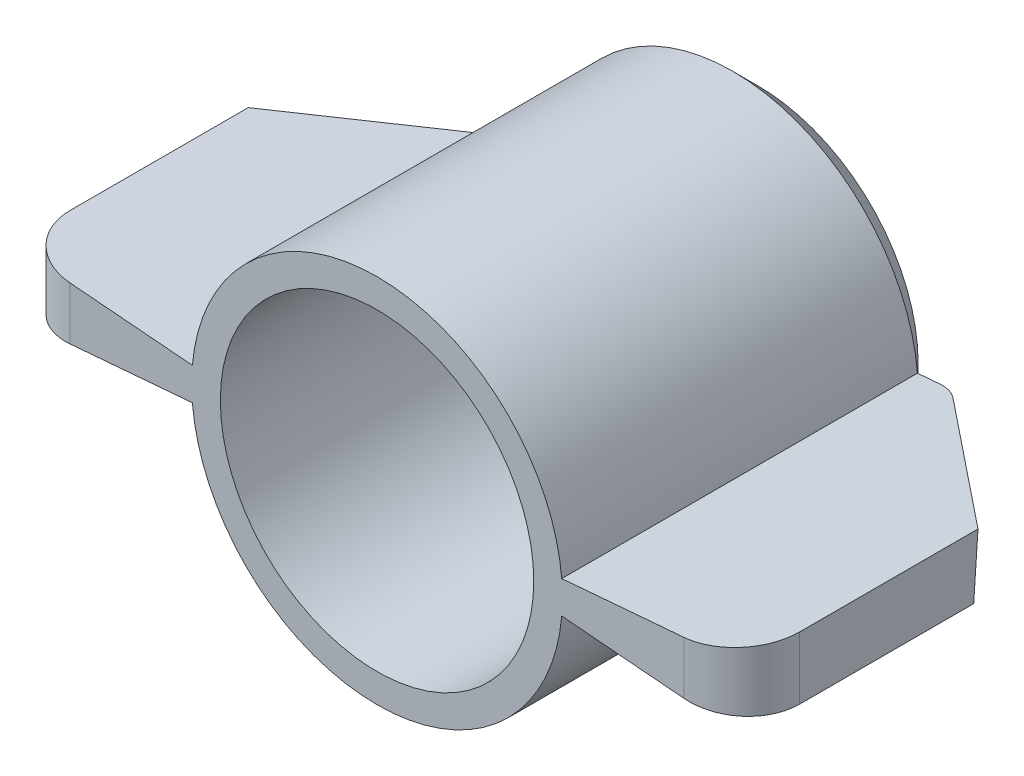
ISO-10303-21;
HEADER;
FILE_DESCRIPTION(('STEP AP214'),'2;1');
FILE_NAME('part.step','',(''),(''),'','','');
FILE_SCHEMA(('AUTOMOTIVE_DESIGN { 1 0 10303 214 1 1 1 1 }'));
ENDSEC;
DATA;
#1=APPLICATION_CONTEXT('core data for automotive mechanical design processes');
#2=APPLICATION_PROTOCOL_DEFINITION('international standard','automotive_design',2000,#1);
#3=PRODUCT_CONTEXT('',#1,'mechanical');
#4=PRODUCT('Part','Part','',(#3));
#5=PRODUCT_RELATED_PRODUCT_CATEGORY('part','',(#4));
#6=PRODUCT_DEFINITION_FORMATION('','',#4);
#7=PRODUCT_DEFINITION_CONTEXT('part definition',#1,'design');
#8=PRODUCT_DEFINITION('design','',#6,#7);
#9=PRODUCT_DEFINITION_SHAPE('','',#8);
#10=(LENGTH_UNIT() NAMED_UNIT(*) SI_UNIT(.MILLI.,.METRE.));
#11=(NAMED_UNIT(*) PLANE_ANGLE_UNIT() SI_UNIT($,.RADIAN.));
#12=(NAMED_UNIT(*) SI_UNIT($,.STERADIAN.) SOLID_ANGLE_UNIT());
#13=UNCERTAINTY_MEASURE_WITH_UNIT(LENGTH_MEASURE(1.E-05),#10,'distance_accuracy_value','');
#14=(GEOMETRIC_REPRESENTATION_CONTEXT(3) GLOBAL_UNCERTAINTY_ASSIGNED_CONTEXT((#13)) GLOBAL_UNIT_ASSIGNED_CONTEXT((#10,
#11,#12)) REPRESENTATION_CONTEXT('',''));
#15=CARTESIAN_POINT('',(0.,0.,0.));
#16=DIRECTION('',(0.,0.,1.));
#17=DIRECTION('',(1.,0.,0.));
#18=AXIS2_PLACEMENT_3D('',#15,#16,#17);
#19=CARTESIAN_POINT('',(5.01,-0.44,0.68));
#20=DIRECTION('',(-0.0832134452583385,-0.996531746874247,0.));
#21=DIRECTION('',(0.996531746874247,-0.0832134452583385,0.));
#22=AXIS2_PLACEMENT_3D('',#19,#20,#21);
#23=PLANE('',#22);
#24=DIRECTION('',(0.,0.,1.));
#25=VECTOR('',#24,1.);
#26=CARTESIAN_POINT('',(9.92,-0.850000000000001,0.68));
#27=LINE('',#26,#25);
#28=CARTESIAN_POINT('',(9.92,-0.849999999999984,4.05));
#29=VERTEX_POINT('',#28);
#30=CARTESIAN_POINT('',(9.92,-0.850000000000001,8.78));
#31=VERTEX_POINT('',#30);
#32=EDGE_CURVE('E134',#29,#31,#27,.T.);
#33=ORIENTED_EDGE('',*,*,#32,.T.);
#34=CARTESIAN_POINT('',(8.35,-0.718900203665989,8.78));
#35=DIRECTION('',(-0.0832134452583385,-0.996531746874247,0.));
#36=DIRECTION('',(-0.996531746874247,0.0832134452583385,0.));
#37=AXIS2_PLACEMENT_3D('',#34,#35,#36);
#38=ELLIPSE('',#37,1.57546410831819,1.57);
#39=CARTESIAN_POINT('',(8.35,-0.718900203665989,10.35));
#40=VERTEX_POINT('',#39);
#41=EDGE_CURVE('E11',#31,#40,#38,.T.);
#42=ORIENTED_EDGE('',*,*,#41,.T.);
#43=DIRECTION('',(0.996531746874247,-0.0832134452583385,0.));
#44=VECTOR('',#43,1.);
#45=CARTESIAN_POINT('',(5.01,-0.44,10.35));
#46=LINE('',#45,#44);
#47=CARTESIAN_POINT('',(5.02067868978206,-0.44089170322009,10.35));
#48=VERTEX_POINT('',#47);
#49=EDGE_CURVE('E163',#48,#40,#46,.T.);
#50=ORIENTED_EDGE('',*,*,#49,.F.);
#51=DIRECTION('',(0.,0.,-1.));
#52=VECTOR('',#51,1.);
#53=CARTESIAN_POINT('',(5.02067868978206,-0.44089170322009,10.35));
#54=LINE('',#53,#52);
#55=CARTESIAN_POINT('',(5.02067868978206,-0.44089170322009,0.679999999999998));
#56=VERTEX_POINT('',#55);
#57=EDGE_CURVE('E173',#56,#48,#54,.F.);
#58=ORIENTED_EDGE('',*,*,#57,.F.);
#59=DIRECTION('',(0.996531746874247,-0.0832134452583385,0.));
#60=VECTOR('',#59,1.);
#61=CARTESIAN_POINT('',(5.01,-0.44,0.68));
#62=LINE('',#61,#60);
#63=CARTESIAN_POINT('',(5.5565518613589,-0.485638750133839,0.68));
#64=VERTEX_POINT('',#63);
#65=EDGE_CURVE('E164',#56,#64,#62,.T.);
#66=ORIENTED_EDGE('',*,*,#65,.T.);
#67=CARTESIAN_POINT('',(5.5565518613589,-0.48563875013384,1.52));
#68=DIRECTION('',(-0.0832134452583385,-0.996531746874247,0.));
#69=DIRECTION('',(0.996531746874247,-0.0832134452583385,0.));
#70=AXIS2_PLACEMENT_3D('',#67,#68,#69);
#71=CIRCLE('',#70,0.84);
#72=CARTESIAN_POINT('',(6.08991778798713,-0.530176434434771,0.872591950166575));
#73=VERTEX_POINT('',#72);
#74=EDGE_CURVE('E138',#64,#73,#71,.T.);
#75=ORIENTED_EDGE('',*,*,#74,.T.);
#76=DIRECTION('',(0.768050803382088,-0.0641345884697875,0.637169300881595));
#77=VECTOR('',#76,1.);
#78=CARTESIAN_POINT('',(5.3541797794434,-0.468740063049245,0.262229106365719));
#79=LINE('',#78,#77);
#80=EDGE_CURVE('E132',#73,#29,#79,.T.);
#81=ORIENTED_EDGE('',*,*,#80,.T.);
#82=EDGE_LOOP('',(#33,#42,#50,#58,#66,#75,#81));
#83=FACE_BOUND('',#82,.T.);
#84=ADVANCED_FACE('F32',(#83),#23,.T.);
#85=CARTESIAN_POINT('',(5.01,0.44,0.68));
#86=DIRECTION('',(0.0832134452583383,-0.996531746874247,0.));
#87=DIRECTION('',(0.996531746874247,0.0832134452583383,0.));
#88=AXIS2_PLACEMENT_3D('',#85,#86,#87);
#89=PLANE('',#88);
#90=DIRECTION('',(0.996531746874247,0.0832134452583383,0.));
#91=VECTOR('',#90,1.);
#92=CARTESIAN_POINT('',(5.01,0.44,10.35));
#93=LINE('',#92,#91);
#94=CARTESIAN_POINT('',(5.02067868978206,0.44089170322009,10.35));
#95=VERTEX_POINT('',#94);
#96=CARTESIAN_POINT('',(8.35,0.718900203665988,10.35));
#97=VERTEX_POINT('',#96);
#98=EDGE_CURVE('E161',#95,#97,#93,.T.);
#99=ORIENTED_EDGE('',*,*,#98,.T.);
#100=CARTESIAN_POINT('',(8.35,0.718900203665988,8.78));
#101=DIRECTION('',(0.0832134452583383,-0.996531746874247,0.));
#102=DIRECTION('',(0.996531746874247,0.0832134452583383,0.));
#103=AXIS2_PLACEMENT_3D('',#100,#101,#102);
#104=ELLIPSE('',#103,1.57546410831819,1.57);
#105=CARTESIAN_POINT('',(9.92,0.85,8.78));
#106=VERTEX_POINT('',#105);
#107=EDGE_CURVE('E54',#97,#106,#104,.F.);
#108=ORIENTED_EDGE('',*,*,#107,.T.);
#109=DIRECTION('',(0.,0.,1.));
#110=VECTOR('',#109,1.);
#111=CARTESIAN_POINT('',(9.92,0.85,0.68));
#112=LINE('',#111,#110);
#113=CARTESIAN_POINT('',(9.92,0.85,3.93305047592308));
#114=VERTEX_POINT('',#113);
#115=EDGE_CURVE('E151',#114,#106,#112,.T.);
#116=ORIENTED_EDGE('',*,*,#115,.F.);
#117=DIRECTION('',(0.772375493653474,0.0644957133193328,0.631883216873959));
#118=VECTOR('',#117,1.);
#119=CARTESIAN_POINT('',(5.38279222210662,0.471129289422345,0.221144194744403));
#120=LINE('',#119,#118);
#121=CARTESIAN_POINT('',(6.17908221406571,0.537621936408746,0.872591950166574));
#122=VERTEX_POINT('',#121);
#123=EDGE_CURVE('E143',#122,#114,#120,.T.);
#124=ORIENTED_EDGE('',*,*,#123,.F.);
#125=CARTESIAN_POINT('',(5.63822599401507,0.492458789724272,1.52));
#126=DIRECTION('',(0.0832134452583383,-0.996531746874247,0.));
#127=DIRECTION('',(-0.996531746874247,-0.0832134452583383,0.));
#128=AXIS2_PLACEMENT_3D('',#125,#126,#127);
#129=ELLIPSE('',#128,0.85179649122807,0.84);
#130=CARTESIAN_POINT('',(5.63822599401507,0.492458789724273,0.68));
#131=VERTEX_POINT('',#130);
#132=EDGE_CURVE('E217',#122,#131,#129,.F.);
#133=ORIENTED_EDGE('',*,*,#132,.T.);
#134=DIRECTION('',(0.996531746874247,0.0832134452583383,0.));
#135=VECTOR('',#134,1.);
#136=CARTESIAN_POINT('',(5.01,0.44,0.68));
#137=LINE('',#136,#135);
#138=CARTESIAN_POINT('',(5.02067868978206,0.44089170322009,0.68));
#139=VERTEX_POINT('',#138);
#140=EDGE_CURVE('E154',#139,#131,#137,.T.);
#141=ORIENTED_EDGE('',*,*,#140,.F.);
#142=DIRECTION('',(0.,0.,-1.));
#143=VECTOR('',#142,1.);
#144=CARTESIAN_POINT('',(5.02067868978206,0.44089170322009,10.35));
#145=LINE('',#144,#143);
#146=EDGE_CURVE('E167',#139,#95,#145,.F.);
#147=ORIENTED_EDGE('',*,*,#146,.T.);
#148=EDGE_LOOP('',(#99,#108,#116,#124,#133,#141,#147));
#149=FACE_BOUND('',#148,.T.);
#150=ADVANCED_FACE('F251',(#149),#89,.F.);
#151=CARTESIAN_POINT('',(9.92,0.,0.68));
#152=DIRECTION('',(1.,0.,0.));
#153=DIRECTION('',(0.,0.,-1.));
#154=AXIS2_PLACEMENT_3D('',#151,#152,#153);
#155=PLANE('',#154);
#156=ORIENTED_EDGE('',*,*,#115,.T.);
#157=DIRECTION('',(0.,1.,0.));
#158=VECTOR('',#157,1.);
#159=CARTESIAN_POINT('',(9.92,0.,8.78));
#160=LINE('',#159,#158);
#161=EDGE_CURVE('E40',#106,#31,#160,.F.);
#162=ORIENTED_EDGE('',*,*,#161,.T.);
#163=ORIENTED_EDGE('',*,*,#32,.F.);
#164=DIRECTION('',(0.,0.997642069995539,-0.0686316266382872));
#165=VECTOR('',#164,1.);
#166=CARTESIAN_POINT('',(9.92,0.226739464335616,3.9759269600536));
#167=LINE('',#166,#165);
#168=EDGE_CURVE('E146',#29,#114,#167,.T.);
#169=ORIENTED_EDGE('',*,*,#168,.T.);
#170=EDGE_LOOP('',(#156,#162,#163,#169));
#171=FACE_BOUND('',#170,.T.);
#172=ADVANCED_FACE('F150',(#171),#155,.T.);
#173=CARTESIAN_POINT('',(0.,0.,0.68));
#174=DIRECTION('',(0.,0.,1.));
#175=DIRECTION('',(1.,0.,0.));
#176=AXIS2_PLACEMENT_3D('',#173,#174,#175);
#177=PLANE('',#176);
#178=ORIENTED_EDGE('',*,*,#140,.T.);
#179=DIRECTION('',(0.0832134452583386,0.996531746874247,0.));
#180=VECTOR('',#179,1.);
#181=CARTESIAN_POINT('',(5.5565518613589,-0.485638750133837,0.68));
#182=LINE('',#181,#180);
#183=EDGE_CURVE('E219',#131,#64,#182,.F.);
#184=ORIENTED_EDGE('',*,*,#183,.T.);
#185=ORIENTED_EDGE('',*,*,#65,.F.);
#186=CARTESIAN_POINT('',(0.,0.,0.679999999999998));
#187=DIRECTION('',(0.,0.,1.));
#188=DIRECTION('',(1.,0.,0.));
#189=AXIS2_PLACEMENT_3D('',#186,#187,#188);
#190=CIRCLE('',#189,5.04);
#191=EDGE_CURVE('E262',#56,#139,#190,.T.);
#192=ORIENTED_EDGE('',*,*,#191,.T.);
#193=EDGE_LOOP('',(#178,#184,#185,#192));
#194=FACE_BOUND('',#193,.T.);
#195=ADVANCED_FACE('F263',(#194),#177,.F.);
#196=CARTESIAN_POINT('',(0.,0.,10.35));
#197=DIRECTION('',(0.,0.,-1.));
#198=DIRECTION('',(-1.,0.,0.));
#199=AXIS2_PLACEMENT_3D('',#196,#197,#198);
#200=CYLINDRICAL_SURFACE('',#199,5.04);
#201=ORIENTED_EDGE('',*,*,#146,.F.);
#202=CARTESIAN_POINT('',(-5.02067868978206,0.44089170322009,0.679999999999998));
#203=VERTEX_POINT('',#202);
#204=EDGE_CURVE('E207',#139,#203,#190,.T.);
#205=ORIENTED_EDGE('',*,*,#204,.T.);
#206=DIRECTION('',(0.,0.,-1.));
#207=VECTOR('',#206,1.);
#208=CARTESIAN_POINT('',(-5.02067868978206,0.44089170322009,10.35));
#209=LINE('',#208,#207);
#210=CARTESIAN_POINT('',(-5.02067868978206,0.44089170322009,10.35));
#211=VERTEX_POINT('',#210);
#212=EDGE_CURVE('E189',#211,#203,#209,.T.);
#213=ORIENTED_EDGE('',*,*,#212,.F.);
#214=CARTESIAN_POINT('',(0.,0.,10.35));
#215=DIRECTION('',(0.,0.,1.));
#216=DIRECTION('',(1.,0.,0.));
#217=AXIS2_PLACEMENT_3D('',#214,#215,#216);
#218=CIRCLE('',#217,5.04);
#219=EDGE_CURVE('E201',#95,#211,#218,.T.);
#220=ORIENTED_EDGE('',*,*,#219,.F.);
#221=EDGE_LOOP('',(#201,#205,#213,#220));
#222=FACE_BOUND('',#221,.T.);
#223=ADVANCED_FACE('F257',(#222),#200,.T.);
#224=CARTESIAN_POINT('',(-5.02067868978206,-0.44089170322009,0.68));
#225=VERTEX_POINT('',#224);
#226=EDGE_CURVE('E212',#225,#56,#190,.T.);
#227=ORIENTED_EDGE('',*,*,#226,.T.);
#228=ORIENTED_EDGE('',*,*,#57,.T.);
#229=CARTESIAN_POINT('',(-5.02067868978206,-0.44089170322009,10.35));
#230=VERTEX_POINT('',#229);
#231=EDGE_CURVE('E204',#230,#48,#218,.T.);
#232=ORIENTED_EDGE('',*,*,#231,.F.);
#233=DIRECTION('',(0.,0.,-1.));
#234=VECTOR('',#233,1.);
#235=CARTESIAN_POINT('',(-5.02067868978206,-0.44089170322009,10.35));
#236=LINE('',#235,#234);
#237=EDGE_CURVE('E194',#225,#230,#236,.F.);
#238=ORIENTED_EDGE('',*,*,#237,.F.);
#239=EDGE_LOOP('',(#227,#228,#232,#238));
#240=FACE_BOUND('',#239,.T.);
#241=ADVANCED_FACE('F270',(#240),#200,.T.);
#242=CARTESIAN_POINT('',(0.,0.,10.35));
#243=DIRECTION('',(0.,0.,1.));
#244=DIRECTION('',(1.,0.,0.));
#245=AXIS2_PLACEMENT_3D('',#242,#243,#244);
#246=PLANE('',#245);
#247=ORIENTED_EDGE('',*,*,#49,.T.);
#248=DIRECTION('',(0.,1.,0.));
#249=VECTOR('',#248,1.);
#250=CARTESIAN_POINT('',(8.35,0.,10.35));
#251=LINE('',#250,#249);
#252=EDGE_CURVE('E240',#40,#97,#251,.T.);
#253=ORIENTED_EDGE('',*,*,#252,.T.);
#254=ORIENTED_EDGE('',*,*,#98,.F.);
#255=ORIENTED_EDGE('',*,*,#219,.T.);
#256=DIRECTION('',(0.996531746874247,-0.0832134452583381,0.));
#257=VECTOR('',#256,1.);
#258=CARTESIAN_POINT('',(-9.92,0.849999999999999,10.35));
#259=LINE('',#258,#257);
#260=CARTESIAN_POINT('',(-8.35,0.718900203665987,10.35));
#261=VERTEX_POINT('',#260);
#262=EDGE_CURVE('E175',#261,#211,#259,.T.);
#263=ORIENTED_EDGE('',*,*,#262,.F.);
#264=DIRECTION('',(0.,-1.,0.));
#265=VECTOR('',#264,1.);
#266=CARTESIAN_POINT('',(-8.35,0.,10.35));
#267=LINE('',#266,#265);
#268=CARTESIAN_POINT('',(-8.35,-0.718900203665989,10.35));
#269=VERTEX_POINT('',#268);
#270=EDGE_CURVE('E231',#261,#269,#267,.T.);
#271=ORIENTED_EDGE('',*,*,#270,.T.);
#272=DIRECTION('',(-0.996531746874247,-0.0832134452583385,0.));
#273=VECTOR('',#272,1.);
#274=CARTESIAN_POINT('',(-5.01,-0.44,10.35));
#275=LINE('',#274,#273);
#276=EDGE_CURVE('E179',#230,#269,#275,.T.);
#277=ORIENTED_EDGE('',*,*,#276,.F.);
#278=ORIENTED_EDGE('',*,*,#231,.T.);
#279=EDGE_LOOP('',(#247,#253,#254,#255,#263,#271,#277,#278));
#280=FACE_BOUND('',#279,.T.);
#281=CARTESIAN_POINT('',(0.,0.,10.35));
#282=DIRECTION('',(0.,0.,1.));
#283=DIRECTION('',(1.,0.,0.));
#284=AXIS2_PLACEMENT_3D('',#281,#282,#283);
#285=CIRCLE('',#284,4.26);
#286=CARTESIAN_POINT('',(4.26,0.,10.35));
#287=VERTEX_POINT('',#286);
#288=EDGE_CURVE('E197',#287,#287,#285,.T.);
#289=ORIENTED_EDGE('',*,*,#288,.F.);
#290=EDGE_LOOP('',(#289));
#291=FACE_BOUND('',#290,.T.);
#292=ADVANCED_FACE('F246',(#280,#291),#246,.T.);
#293=CARTESIAN_POINT('',(0.,0.,0.));
#294=DIRECTION('',(0.,0.,1.));
#295=DIRECTION('',(1.,0.,0.));
#296=AXIS2_PLACEMENT_3D('',#293,#294,#295);
#297=PLANE('',#296);
#298=CARTESIAN_POINT('',(0.,0.,0.));
#299=DIRECTION('',(0.,0.,1.));
#300=DIRECTION('',(1.,0.,0.));
#301=AXIS2_PLACEMENT_3D('',#298,#299,#300);
#302=CIRCLE('',#301,4.26);
#303=CARTESIAN_POINT('',(4.26,0.,0.));
#304=VERTEX_POINT('',#303);
#305=EDGE_CURVE('E198',#304,#304,#302,.T.);
#306=ORIENTED_EDGE('',*,*,#305,.T.);
#307=EDGE_LOOP('',(#306));
#308=FACE_BOUND('',#307,.T.);
#309=CARTESIAN_POINT('',(0.,0.,0.));
#310=DIRECTION('',(0.,0.,1.));
#311=DIRECTION('',(1.,0.,0.));
#312=AXIS2_PLACEMENT_3D('',#309,#310,#311);
#313=CIRCLE('',#312,4.36);
#314=CARTESIAN_POINT('',(4.36,0.,0.));
#315=VERTEX_POINT('',#314);
#316=EDGE_CURVE('E211',#315,#315,#313,.F.);
#317=ORIENTED_EDGE('',*,*,#316,.T.);
#318=EDGE_LOOP('',(#317));
#319=FACE_BOUND('',#318,.T.);
#320=ADVANCED_FACE('F315',(#308,#319),#297,.F.);
#321=CARTESIAN_POINT('',(0.,0.,0.679999999999998));
#322=DIRECTION('',(0.,0.,1.));
#323=DIRECTION('',(1.,0.,0.));
#324=AXIS2_PLACEMENT_3D('',#321,#322,#323);
#325=CONICAL_SURFACE('',#324,5.04,0.785398163397451);
#326=ORIENTED_EDGE('',*,*,#316,.F.);
#327=EDGE_LOOP('',(#326));
#328=FACE_BOUND('',#327,.T.);
#329=EDGE_CURVE('E208',#203,#225,#190,.T.);
#330=ORIENTED_EDGE('',*,*,#329,.F.);
#331=ORIENTED_EDGE('',*,*,#204,.F.);
#332=ORIENTED_EDGE('',*,*,#191,.F.);
#333=ORIENTED_EDGE('',*,*,#226,.F.);
#334=EDGE_LOOP('',(#330,#331,#332,#333));
#335=FACE_BOUND('',#334,.T.);
#336=ADVANCED_FACE('F311',(#328,#335),#325,.T.);
#337=CARTESIAN_POINT('',(0.,0.,0.));
#338=DIRECTION('',(0.,0.,1.));
#339=DIRECTION('',(1.,0.,0.));
#340=AXIS2_PLACEMENT_3D('',#337,#338,#339);
#341=CYLINDRICAL_SURFACE('',#340,4.26);
#342=ORIENTED_EDGE('',*,*,#305,.F.);
#343=EDGE_LOOP('',(#342));
#344=FACE_BOUND('',#343,.T.);
#345=ORIENTED_EDGE('',*,*,#288,.T.);
#346=EDGE_LOOP('',(#345));
#347=FACE_BOUND('',#346,.T.);
#348=ADVANCED_FACE('F301',(#344,#347),#341,.F.);
#349=CARTESIAN_POINT('',(-5.01,-0.44,0.68));
#350=DIRECTION('',(-0.0832134452583385,0.996531746874247,0.));
#351=DIRECTION('',(-0.996531746874247,-0.0832134452583385,0.));
#352=AXIS2_PLACEMENT_3D('',#349,#350,#351);
#353=PLANE('',#352);
#354=ORIENTED_EDGE('',*,*,#276,.T.);
#355=CARTESIAN_POINT('',(-8.35,-0.718900203665989,8.78));
#356=DIRECTION('',(-0.0832134452583385,0.996531746874247,0.));
#357=DIRECTION('',(-0.996531746874247,-0.0832134452583385,0.));
#358=AXIS2_PLACEMENT_3D('',#355,#356,#357);
#359=ELLIPSE('',#358,1.57546410831819,1.57);
#360=CARTESIAN_POINT('',(-9.92,-0.850000000000001,8.78));
#361=VERTEX_POINT('',#360);
#362=EDGE_CURVE('E234',#269,#361,#359,.F.);
#363=ORIENTED_EDGE('',*,*,#362,.T.);
#364=DIRECTION('',(0.,0.,1.));
#365=VECTOR('',#364,1.);
#366=CARTESIAN_POINT('',(-9.92,-0.850000000000001,0.68));
#367=LINE('',#366,#365);
#368=CARTESIAN_POINT('',(-9.92,-0.850000000000059,4.05));
#369=VERTEX_POINT('',#368);
#370=EDGE_CURVE('E186',#369,#361,#367,.T.);
#371=ORIENTED_EDGE('',*,*,#370,.F.);
#372=DIRECTION('',(0.768050803382088,0.0641345884697876,-0.637169300881595));
#373=VECTOR('',#372,1.);
#374=CARTESIAN_POINT('',(-5.3541797794434,-0.468740063049245,0.26222910636572));
#375=LINE('',#374,#373);
#376=CARTESIAN_POINT('',(-6.08991778798713,-0.53017643443477,0.872591950166574));
#377=VERTEX_POINT('',#376);
#378=EDGE_CURVE('E152',#369,#377,#375,.T.);
#379=ORIENTED_EDGE('',*,*,#378,.T.);
#380=CARTESIAN_POINT('',(-5.5565518613589,-0.485638750133839,1.52));
#381=DIRECTION('',(-0.0832134452583385,0.996531746874247,0.));
#382=DIRECTION('',(-0.996531746874247,-0.0832134452583385,0.));
#383=AXIS2_PLACEMENT_3D('',#380,#381,#382);
#384=CIRCLE('',#383,0.84);
#385=CARTESIAN_POINT('',(-5.5565518613589,-0.485638750133839,0.68));
#386=VERTEX_POINT('',#385);
#387=EDGE_CURVE('E225',#377,#386,#384,.F.);
#388=ORIENTED_EDGE('',*,*,#387,.T.);
#389=DIRECTION('',(-0.996531746874247,-0.0832134452583385,0.));
#390=VECTOR('',#389,1.);
#391=CARTESIAN_POINT('',(-5.01,-0.44,0.68));
#392=LINE('',#391,#390);
#393=EDGE_CURVE('E178',#225,#386,#392,.T.);
#394=ORIENTED_EDGE('',*,*,#393,.F.);
#395=ORIENTED_EDGE('',*,*,#237,.T.);
#396=EDGE_LOOP('',(#354,#363,#371,#379,#388,#394,#395));
#397=FACE_BOUND('',#396,.T.);
#398=ADVANCED_FACE('F297',(#397),#353,.F.);
#399=CARTESIAN_POINT('',(-9.92,0.849999999999999,0.68));
#400=DIRECTION('',(-0.083213445258338,-0.996531746874247,0.));
#401=DIRECTION('',(0.996531746874247,-0.0832134452583381,0.));
#402=AXIS2_PLACEMENT_3D('',#399,#400,#401);
#403=PLANE('',#402);
#404=DIRECTION('',(0.,0.,1.));
#405=VECTOR('',#404,1.);
#406=CARTESIAN_POINT('',(-9.92,0.849999999999999,0.68));
#407=LINE('',#406,#405);
#408=CARTESIAN_POINT('',(-9.92,0.849999999999999,3.93305047592308));
#409=VERTEX_POINT('',#408);
#410=CARTESIAN_POINT('',(-9.92,0.849999999999999,8.78));
#411=VERTEX_POINT('',#410);
#412=EDGE_CURVE('E182',#409,#411,#407,.T.);
#413=ORIENTED_EDGE('',*,*,#412,.T.);
#414=CARTESIAN_POINT('',(-8.35,0.718900203665987,8.78));
#415=DIRECTION('',(-0.083213445258338,-0.996531746874247,0.));
#416=DIRECTION('',(0.996531746874247,-0.0832134452583381,0.));
#417=AXIS2_PLACEMENT_3D('',#414,#415,#416);
#418=ELLIPSE('',#417,1.57546410831819,1.57);
#419=EDGE_CURVE('E238',#411,#261,#418,.F.);
#420=ORIENTED_EDGE('',*,*,#419,.T.);
#421=ORIENTED_EDGE('',*,*,#262,.T.);
#422=ORIENTED_EDGE('',*,*,#212,.T.);
#423=DIRECTION('',(0.996531746874247,-0.0832134452583381,0.));
#424=VECTOR('',#423,1.);
#425=CARTESIAN_POINT('',(-9.92,0.849999999999999,0.68));
#426=LINE('',#425,#424);
#427=CARTESIAN_POINT('',(-5.63822599401507,0.492458789724273,0.68));
#428=VERTEX_POINT('',#427);
#429=EDGE_CURVE('E176',#428,#203,#426,.T.);
#430=ORIENTED_EDGE('',*,*,#429,.F.);
#431=CARTESIAN_POINT('',(-5.63822599401507,0.492458789724272,1.52));
#432=DIRECTION('',(-0.083213445258338,-0.996531746874247,0.));
#433=DIRECTION('',(-0.996531746874247,0.0832134452583381,0.));
#434=AXIS2_PLACEMENT_3D('',#431,#432,#433);
#435=ELLIPSE('',#434,0.85179649122807,0.84);
#436=CARTESIAN_POINT('',(-6.17908221406571,0.537621936408745,0.872591950166574));
#437=VERTEX_POINT('',#436);
#438=EDGE_CURVE('E229',#428,#437,#435,.F.);
#439=ORIENTED_EDGE('',*,*,#438,.T.);
#440=DIRECTION('',(-0.772375493653474,0.0644957133193327,0.631883216873959));
#441=VECTOR('',#440,1.);
#442=CARTESIAN_POINT('',(-8.33234509925074,0.717425965517882,2.63418419363625));
#443=LINE('',#442,#441);
#444=EDGE_CURVE('E157',#437,#409,#443,.T.);
#445=ORIENTED_EDGE('',*,*,#444,.T.);
#446=EDGE_LOOP('',(#413,#420,#421,#422,#430,#439,#445));
#447=FACE_BOUND('',#446,.T.);
#448=ADVANCED_FACE('F300',(#447),#403,.F.);
#449=CARTESIAN_POINT('',(-9.92,0.,0.68));
#450=DIRECTION('',(-1.,0.,0.));
#451=DIRECTION('',(0.,0.,1.));
#452=AXIS2_PLACEMENT_3D('',#449,#450,#451);
#453=PLANE('',#452);
#454=ORIENTED_EDGE('',*,*,#370,.T.);
#455=DIRECTION('',(0.,-1.,0.));
#456=VECTOR('',#455,1.);
#457=CARTESIAN_POINT('',(-9.92,0.,8.78));
#458=LINE('',#457,#456);
#459=EDGE_CURVE('E236',#361,#411,#458,.F.);
#460=ORIENTED_EDGE('',*,*,#459,.T.);
#461=ORIENTED_EDGE('',*,*,#412,.F.);
#462=DIRECTION('',(0.,0.997642069995538,-0.0686316266382872));
#463=VECTOR('',#462,1.);
#464=CARTESIAN_POINT('',(-9.92,0.226739464335615,3.9759269600536));
#465=LINE('',#464,#463);
#466=EDGE_CURVE('E142',#369,#409,#465,.T.);
#467=ORIENTED_EDGE('',*,*,#466,.F.);
#468=EDGE_LOOP('',(#454,#460,#461,#467));
#469=FACE_BOUND('',#468,.T.);
#470=ADVANCED_FACE('F295',(#469),#453,.T.);
#471=CARTESIAN_POINT('',(0.,0.,0.68));
#472=DIRECTION('',(0.,0.,-1.));
#473=DIRECTION('',(-1.,0.,0.));
#474=AXIS2_PLACEMENT_3D('',#471,#472,#473);
#475=PLANE('',#474);
#476=ORIENTED_EDGE('',*,*,#393,.T.);
#477=DIRECTION('',(0.0832134452583385,-0.996531746874247,0.));
#478=VECTOR('',#477,1.);
#479=CARTESIAN_POINT('',(-5.6424560682543,0.543116508052594,0.68));
#480=LINE('',#479,#478);
#481=EDGE_CURVE('E227',#386,#428,#480,.F.);
#482=ORIENTED_EDGE('',*,*,#481,.T.);
#483=ORIENTED_EDGE('',*,*,#429,.T.);
#484=ORIENTED_EDGE('',*,*,#329,.T.);
#485=EDGE_LOOP('',(#476,#482,#483,#484));
#486=FACE_BOUND('',#485,.T.);
#487=ADVANCED_FACE('F292',(#486),#475,.T.);
#488=CARTESIAN_POINT('',(-2.53274678230067,5.65685821166125,-2.48360667295656));
#489=DIRECTION('',(0.634959436462178,0.0530210527392044,0.770723868849317));
#490=DIRECTION('',(0.771809500172046,0.,-0.635853831823145));
#491=AXIS2_PLACEMENT_3D('',#488,#489,#490);
#492=PLANE('',#491);
#493=ORIENTED_EDGE('',*,*,#444,.F.);
#494=DIRECTION('',(0.0832134452583385,-0.996531746874247,0.));
#495=VECTOR('',#494,1.);
#496=CARTESIAN_POINT('',(-6.08991778798712,-0.53017643443477,0.872591950166574));
#497=LINE('',#496,#495);
#498=EDGE_CURVE('E222',#437,#377,#497,.T.);
#499=ORIENTED_EDGE('',*,*,#498,.T.);
#500=ORIENTED_EDGE('',*,*,#378,.F.);
#501=ORIENTED_EDGE('',*,*,#466,.T.);
#502=EDGE_LOOP('',(#493,#499,#500,#501));
#503=FACE_BOUND('',#502,.T.);
#504=ADVANCED_FACE('F285',(#503),#492,.F.);
#505=CARTESIAN_POINT('',(2.53274678230067,5.65685821166125,-2.48360667295656));
#506=DIRECTION('',(0.634959436462178,-0.0530210527392045,-0.770723868849317));
#507=DIRECTION('',(-0.771809500172046,0.,-0.635853831823146));
#508=AXIS2_PLACEMENT_3D('',#505,#506,#507);
#509=PLANE('',#508);
#510=ORIENTED_EDGE('',*,*,#80,.F.);
#511=DIRECTION('',(0.0832134452583386,0.996531746874247,0.));
#512=VECTOR('',#511,1.);
#513=CARTESIAN_POINT('',(6.17582199488253,0.498578823751664,0.872591950166574));
#514=LINE('',#513,#512);
#515=EDGE_CURVE('E215',#73,#122,#514,.T.);
#516=ORIENTED_EDGE('',*,*,#515,.T.);
#517=ORIENTED_EDGE('',*,*,#123,.T.);
#518=ORIENTED_EDGE('',*,*,#168,.F.);
#519=EDGE_LOOP('',(#510,#516,#517,#518));
#520=FACE_BOUND('',#519,.T.);
#521=ADVANCED_FACE('F147',(#520),#509,.T.);
#522=CARTESIAN_POINT('',(6.04497916876286,5.36357607755748,1.52));
#523=DIRECTION('',(-0.0832134452583386,-0.996531746874247,0.));
#524=DIRECTION('',(0.996531746874247,-0.0832134452583386,0.));
#525=AXIS2_PLACEMENT_3D('',#522,#523,#524);
#526=CYLINDRICAL_SURFACE('',#525,0.84);
#527=ORIENTED_EDGE('',*,*,#74,.F.);
#528=ORIENTED_EDGE('',*,*,#183,.F.);
#529=ORIENTED_EDGE('',*,*,#132,.F.);
#530=ORIENTED_EDGE('',*,*,#515,.F.);
#531=EDGE_LOOP('',(#527,#528,#529,#530));
#532=FACE_BOUND('',#531,.T.);
#533=ADVANCED_FACE('F324',(#532),#526,.T.);
#534=CARTESIAN_POINT('',(-6.04497916876286,5.36357607755748,1.52));
#535=DIRECTION('',(-0.0832134452583385,0.996531746874247,0.));
#536=DIRECTION('',(-0.996531746874247,-0.0832134452583385,0.));
#537=AXIS2_PLACEMENT_3D('',#534,#535,#536);
#538=CYLINDRICAL_SURFACE('',#537,0.84);
#539=ORIENTED_EDGE('',*,*,#438,.F.);
#540=ORIENTED_EDGE('',*,*,#481,.F.);
#541=ORIENTED_EDGE('',*,*,#387,.F.);
#542=ORIENTED_EDGE('',*,*,#498,.F.);
#543=EDGE_LOOP('',(#539,#540,#541,#542));
#544=FACE_BOUND('',#543,.T.);
#545=ADVANCED_FACE('F276',(#544),#538,.T.);
#546=CARTESIAN_POINT('',(-8.35,0.,8.78));
#547=DIRECTION('',(0.,-1.,0.));
#548=DIRECTION('',(0.,0.,-1.));
#549=AXIS2_PLACEMENT_3D('',#546,#547,#548);
#550=CYLINDRICAL_SURFACE('',#549,1.57);
#551=ORIENTED_EDGE('',*,*,#419,.F.);
#552=ORIENTED_EDGE('',*,*,#459,.F.);
#553=ORIENTED_EDGE('',*,*,#362,.F.);
#554=ORIENTED_EDGE('',*,*,#270,.F.);
#555=EDGE_LOOP('',(#551,#552,#553,#554));
#556=FACE_BOUND('',#555,.T.);
#557=ADVANCED_FACE('F272',(#556),#550,.T.);
#558=CARTESIAN_POINT('',(8.35,0.,8.78));
#559=DIRECTION('',(0.,1.,0.));
#560=DIRECTION('',(0.,0.,1.));
#561=AXIS2_PLACEMENT_3D('',#558,#559,#560);
#562=CYLINDRICAL_SURFACE('',#561,1.57);
#563=ORIENTED_EDGE('',*,*,#41,.F.);
#564=ORIENTED_EDGE('',*,*,#161,.F.);
#565=ORIENTED_EDGE('',*,*,#107,.F.);
#566=ORIENTED_EDGE('',*,*,#252,.F.);
#567=EDGE_LOOP('',(#563,#564,#565,#566));
#568=FACE_BOUND('',#567,.T.);
#569=ADVANCED_FACE('F34',(#568),#562,.T.);
#570=CLOSED_SHELL('',(#84,#150,#172,#195,#223,#241,#292,#320,#336,#348,#398,#448,#470,#487,#504,
#521,#533,#545,#557,#569));
#571=MANIFOLD_SOLID_BREP('B2',#570);
#572=ADVANCED_BREP_SHAPE_REPRESENTATION('',(#18,#571),#14);
#573=SHAPE_DEFINITION_REPRESENTATION(#9,#572);
ENDSEC;
END-ISO-10303-21;
